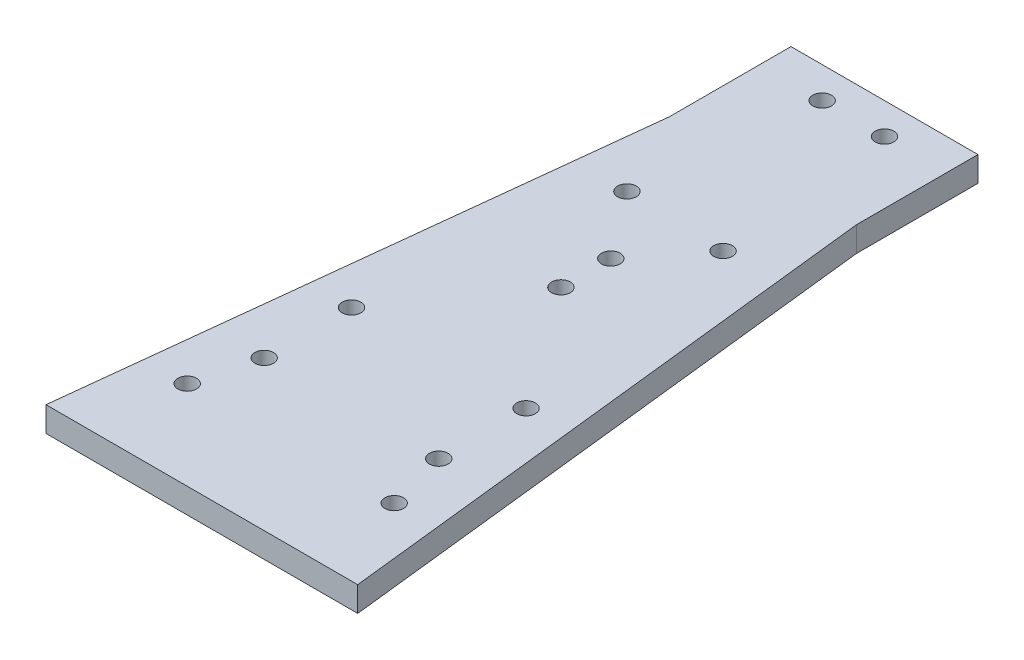
ISO-10303-21;
HEADER;
FILE_DESCRIPTION(('STEP AP214'),'2;1');
FILE_NAME('part.step','',(''),(''),'','','');
FILE_SCHEMA(('AUTOMOTIVE_DESIGN { 1 0 10303 214 1 1 1 1 }'));
ENDSEC;
DATA;
#1=APPLICATION_CONTEXT('core data for automotive mechanical design processes');
#2=APPLICATION_PROTOCOL_DEFINITION('international standard','automotive_design',2000,#1);
#3=PRODUCT_CONTEXT('',#1,'mechanical');
#4=PRODUCT('Part','Part','',(#3));
#5=PRODUCT_RELATED_PRODUCT_CATEGORY('part','',(#4));
#6=PRODUCT_DEFINITION_FORMATION('','',#4);
#7=PRODUCT_DEFINITION_CONTEXT('part definition',#1,'design');
#8=PRODUCT_DEFINITION('design','',#6,#7);
#9=PRODUCT_DEFINITION_SHAPE('','',#8);
#10=(LENGTH_UNIT() NAMED_UNIT(*) SI_UNIT(.MILLI.,.METRE.));
#11=(NAMED_UNIT(*) PLANE_ANGLE_UNIT() SI_UNIT($,.RADIAN.));
#12=(NAMED_UNIT(*) SI_UNIT($,.STERADIAN.) SOLID_ANGLE_UNIT());
#13=UNCERTAINTY_MEASURE_WITH_UNIT(LENGTH_MEASURE(1.E-05),#10,'distance_accuracy_value','');
#14=(GEOMETRIC_REPRESENTATION_CONTEXT(3) GLOBAL_UNCERTAINTY_ASSIGNED_CONTEXT((#13)) GLOBAL_UNIT_ASSIGNED_CONTEXT((#10,
#11,#12)) REPRESENTATION_CONTEXT('',''));
#15=CARTESIAN_POINT('',(0.,0.,0.));
#16=DIRECTION('',(0.,0.,1.));
#17=DIRECTION('',(1.,0.,0.));
#18=AXIS2_PLACEMENT_3D('',#15,#16,#17);
#19=CARTESIAN_POINT('',(-9.99999999999999,4.,90.));
#20=DIRECTION('',(0.993883734673619,0.,0.110431526074846));
#21=DIRECTION('',(0.110431526074846,0.,-0.993883734673619));
#22=AXIS2_PLACEMENT_3D('',#19,#20,#21);
#23=PLANE('',#22);
#24=DIRECTION('',(-0.110431526074847,0.,0.993883734673619));
#25=VECTOR('',#24,1.);
#26=CARTESIAN_POINT('',(-9.99999999999999,0.,90.));
#27=LINE('',#26,#25);
#28=CARTESIAN_POINT('',(0.,0.,0.));
#29=VERTEX_POINT('',#28);
#30=CARTESIAN_POINT('',(-9.99999999999999,0.,90.));
#31=VERTEX_POINT('',#30);
#32=EDGE_CURVE('E167',#29,#31,#27,.T.);
#33=ORIENTED_EDGE('',*,*,#32,.T.);
#34=DIRECTION('',(0.,-1.,0.));
#35=VECTOR('',#34,1.);
#36=CARTESIAN_POINT('',(-9.99999999999999,4.,90.));
#37=LINE('',#36,#35);
#38=CARTESIAN_POINT('',(-9.99999999999999,4.,90.));
#39=VERTEX_POINT('',#38);
#40=EDGE_CURVE('E11',#39,#31,#37,.T.);
#41=ORIENTED_EDGE('',*,*,#40,.F.);
#42=DIRECTION('',(-0.110431526074847,0.,0.993883734673619));
#43=VECTOR('',#42,1.);
#44=CARTESIAN_POINT('',(-9.99999999999999,4.,90.));
#45=LINE('',#44,#43);
#46=CARTESIAN_POINT('',(0.,4.,0.));
#47=VERTEX_POINT('',#46);
#48=EDGE_CURVE('E52',#47,#39,#45,.T.);
#49=ORIENTED_EDGE('',*,*,#48,.F.);
#50=DIRECTION('',(0.,-1.,0.));
#51=VECTOR('',#50,1.);
#52=CARTESIAN_POINT('',(0.,4.,0.));
#53=LINE('',#52,#51);
#54=EDGE_CURVE('E71',#47,#29,#53,.T.);
#55=ORIENTED_EDGE('',*,*,#54,.T.);
#56=EDGE_LOOP('',(#33,#41,#49,#55));
#57=FACE_BOUND('',#56,.T.);
#58=ADVANCED_FACE('F34',(#57),#23,.F.);
#59=CARTESIAN_POINT('',(40.,4.,90.));
#60=DIRECTION('',(0.,0.,-1.));
#61=DIRECTION('',(-1.,0.,0.));
#62=AXIS2_PLACEMENT_3D('',#59,#60,#61);
#63=PLANE('',#62);
#64=DIRECTION('',(1.,0.,0.));
#65=VECTOR('',#64,1.);
#66=CARTESIAN_POINT('',(40.,0.,90.));
#67=LINE('',#66,#65);
#68=CARTESIAN_POINT('',(40.,0.,90.));
#69=VERTEX_POINT('',#68);
#70=EDGE_CURVE('E66',#31,#69,#67,.T.);
#71=ORIENTED_EDGE('',*,*,#70,.T.);
#72=DIRECTION('',(0.,-1.,0.));
#73=VECTOR('',#72,1.);
#74=CARTESIAN_POINT('',(40.,4.,90.));
#75=LINE('',#74,#73);
#76=CARTESIAN_POINT('',(40.,4.,90.));
#77=VERTEX_POINT('',#76);
#78=EDGE_CURVE('E43',#77,#69,#75,.T.);
#79=ORIENTED_EDGE('',*,*,#78,.F.);
#80=DIRECTION('',(1.,0.,0.));
#81=VECTOR('',#80,1.);
#82=CARTESIAN_POINT('',(40.,4.,90.));
#83=LINE('',#82,#81);
#84=EDGE_CURVE('E76',#39,#77,#83,.T.);
#85=ORIENTED_EDGE('',*,*,#84,.F.);
#86=ORIENTED_EDGE('',*,*,#40,.T.);
#87=EDGE_LOOP('',(#71,#79,#85,#86));
#88=FACE_BOUND('',#87,.T.);
#89=ADVANCED_FACE('F260',(#88),#63,.F.);
#90=CARTESIAN_POINT('',(40.,4.,90.));
#91=DIRECTION('',(-0.993883734673619,0.,0.110431526074847));
#92=DIRECTION('',(0.110431526074847,0.,0.993883734673619));
#93=AXIS2_PLACEMENT_3D('',#90,#91,#92);
#94=PLANE('',#93);
#95=DIRECTION('',(-0.110431526074847,0.,-0.993883734673619));
#96=VECTOR('',#95,1.);
#97=CARTESIAN_POINT('',(40.,0.,90.));
#98=LINE('',#97,#96);
#99=CARTESIAN_POINT('',(30.,0.,0.));
#100=VERTEX_POINT('',#99);
#101=EDGE_CURVE('E171',#69,#100,#98,.T.);
#102=ORIENTED_EDGE('',*,*,#101,.T.);
#103=DIRECTION('',(0.,-1.,0.));
#104=VECTOR('',#103,1.);
#105=CARTESIAN_POINT('',(30.,4.,0.));
#106=LINE('',#105,#104);
#107=CARTESIAN_POINT('',(30.,4.,0.));
#108=VERTEX_POINT('',#107);
#109=EDGE_CURVE('E179',#108,#100,#106,.T.);
#110=ORIENTED_EDGE('',*,*,#109,.F.);
#111=DIRECTION('',(-0.110431526074847,0.,-0.993883734673619));
#112=VECTOR('',#111,1.);
#113=CARTESIAN_POINT('',(40.,4.,90.));
#114=LINE('',#113,#112);
#115=EDGE_CURVE('E173',#77,#108,#114,.T.);
#116=ORIENTED_EDGE('',*,*,#115,.F.);
#117=ORIENTED_EDGE('',*,*,#78,.T.);
#118=EDGE_LOOP('',(#102,#110,#116,#117));
#119=FACE_BOUND('',#118,.T.);
#120=ADVANCED_FACE('F264',(#119),#94,.F.);
#121=CARTESIAN_POINT('',(0.,4.,0.));
#122=DIRECTION('',(0.,-1.,0.));
#123=DIRECTION('',(0.,0.,-1.));
#124=AXIS2_PLACEMENT_3D('',#121,#122,#123);
#125=PLANE('',#124);
#126=CARTESIAN_POINT('',(10.,4.,-14.5));
#127=DIRECTION('',(0.,-1.,0.));
#128=DIRECTION('',(0.,0.,-1.));
#129=AXIS2_PLACEMENT_3D('',#126,#127,#128);
#130=CIRCLE('',#129,1.5);
#131=CARTESIAN_POINT('',(10.,4.,-16.));
#132=VERTEX_POINT('',#131);
#133=EDGE_CURVE('E112',#132,#132,#130,.T.);
#134=ORIENTED_EDGE('',*,*,#133,.T.);
#135=EDGE_LOOP('',(#134));
#136=FACE_BOUND('',#135,.T.);
#137=CARTESIAN_POINT('',(20.,4.,-14.5));
#138=DIRECTION('',(0.,-1.,0.));
#139=DIRECTION('',(0.,0.,-1.));
#140=AXIS2_PLACEMENT_3D('',#137,#138,#139);
#141=CIRCLE('',#140,1.5);
#142=CARTESIAN_POINT('',(20.,4.,-16.));
#143=VERTEX_POINT('',#142);
#144=EDGE_CURVE('E230',#143,#143,#141,.T.);
#145=ORIENTED_EDGE('',*,*,#144,.T.);
#146=EDGE_LOOP('',(#145));
#147=FACE_BOUND('',#146,.T.);
#148=CARTESIAN_POINT('',(31.5999999999999,4.,75.7500000000001));
#149=DIRECTION('',(0.,1.,0.));
#150=DIRECTION('',(0.,0.,1.));
#151=AXIS2_PLACEMENT_3D('',#148,#149,#150);
#152=CIRCLE('',#151,1.5);
#153=CARTESIAN_POINT('',(31.5999999999999,4.,77.2500000000001));
#154=VERTEX_POINT('',#153);
#155=EDGE_CURVE('E115',#154,#154,#152,.T.);
#156=ORIENTED_EDGE('',*,*,#155,.F.);
#157=EDGE_LOOP('',(#156));
#158=FACE_BOUND('',#157,.T.);
#159=CARTESIAN_POINT('',(-1.60000000000006,4.,75.7499999999999));
#160=DIRECTION('',(0.,1.,0.));
#161=DIRECTION('',(0.,0.,1.));
#162=AXIS2_PLACEMENT_3D('',#159,#160,#161);
#163=CIRCLE('',#162,1.49999999999994);
#164=CARTESIAN_POINT('',(-1.60000000000006,4.,77.2499999999999));
#165=VERTEX_POINT('',#164);
#166=EDGE_CURVE('E118',#165,#165,#163,.T.);
#167=ORIENTED_EDGE('',*,*,#166,.F.);
#168=EDGE_LOOP('',(#167));
#169=FACE_BOUND('',#168,.T.);
#170=CARTESIAN_POINT('',(22.9530548812237,4.,14.3472000298422));
#171=DIRECTION('',(0.,1.,0.));
#172=DIRECTION('',(0.,0.,1.));
#173=AXIS2_PLACEMENT_3D('',#170,#171,#172);
#174=CIRCLE('',#173,1.5);
#175=CARTESIAN_POINT('',(22.9530548812237,4.,15.8472000298422));
#176=VERTEX_POINT('',#175);
#177=EDGE_CURVE('E124',#176,#176,#174,.T.);
#178=ORIENTED_EDGE('',*,*,#177,.F.);
#179=EDGE_LOOP('',(#178));
#180=FACE_BOUND('',#179,.T.);
#181=CARTESIAN_POINT('',(6.96315472119461,4.,13.7787874399901));
#182=DIRECTION('',(0.,1.,0.));
#183=DIRECTION('',(0.,0.,1.));
#184=AXIS2_PLACEMENT_3D('',#181,#182,#183);
#185=CIRCLE('',#184,1.5);
#186=CARTESIAN_POINT('',(6.96315472119461,4.,15.2787874399902));
#187=VERTEX_POINT('',#186);
#188=EDGE_CURVE('E127',#187,#187,#185,.T.);
#189=ORIENTED_EDGE('',*,*,#188,.F.);
#190=EDGE_LOOP('',(#189));
#191=FACE_BOUND('',#190,.T.);
#192=CARTESIAN_POINT('',(15.,4.,32.4));
#193=DIRECTION('',(0.,1.,0.));
#194=DIRECTION('',(0.,0.,1.));
#195=AXIS2_PLACEMENT_3D('',#192,#193,#194);
#196=CIRCLE('',#195,1.5);
#197=CARTESIAN_POINT('',(15.,4.,33.9));
#198=VERTEX_POINT('',#197);
#199=EDGE_CURVE('E137',#198,#198,#196,.T.);
#200=ORIENTED_EDGE('',*,*,#199,.F.);
#201=EDGE_LOOP('',(#200));
#202=FACE_BOUND('',#201,.T.);
#203=CARTESIAN_POINT('',(15.,4.,24.4));
#204=DIRECTION('',(0.,1.,0.));
#205=DIRECTION('',(0.,0.,1.));
#206=AXIS2_PLACEMENT_3D('',#203,#204,#205);
#207=CIRCLE('',#206,1.5);
#208=CARTESIAN_POINT('',(15.,4.,25.9));
#209=VERTEX_POINT('',#208);
#210=EDGE_CURVE('E143',#209,#209,#207,.T.);
#211=ORIENTED_EDGE('',*,*,#210,.F.);
#212=EDGE_LOOP('',(#211));
#213=FACE_BOUND('',#212,.T.);
#214=CARTESIAN_POINT('',(1.00000000000001,4.,52.));
#215=DIRECTION('',(0.,1.,0.));
#216=DIRECTION('',(0.,0.,1.));
#217=AXIS2_PLACEMENT_3D('',#214,#215,#216);
#218=CIRCLE('',#217,1.5);
#219=CARTESIAN_POINT('',(1.00000000000001,4.,53.5));
#220=VERTEX_POINT('',#219);
#221=EDGE_CURVE('E156',#220,#220,#218,.T.);
#222=ORIENTED_EDGE('',*,*,#221,.F.);
#223=EDGE_LOOP('',(#222));
#224=FACE_BOUND('',#223,.T.);
#225=CARTESIAN_POINT('',(29.,4.,66.));
#226=DIRECTION('',(0.,1.,0.));
#227=DIRECTION('',(0.,0.,1.));
#228=AXIS2_PLACEMENT_3D('',#225,#226,#227);
#229=CIRCLE('',#228,1.5);
#230=CARTESIAN_POINT('',(29.,4.,67.5));
#231=VERTEX_POINT('',#230);
#232=EDGE_CURVE('E149',#231,#231,#229,.T.);
#233=ORIENTED_EDGE('',*,*,#232,.F.);
#234=EDGE_LOOP('',(#233));
#235=FACE_BOUND('',#234,.T.);
#236=CARTESIAN_POINT('',(29.,4.,52.));
#237=DIRECTION('',(0.,1.,0.));
#238=DIRECTION('',(0.,0.,1.));
#239=AXIS2_PLACEMENT_3D('',#236,#237,#238);
#240=CIRCLE('',#239,1.5);
#241=CARTESIAN_POINT('',(29.,4.,53.5));
#242=VERTEX_POINT('',#241);
#243=EDGE_CURVE('E136',#242,#242,#240,.T.);
#244=ORIENTED_EDGE('',*,*,#243,.F.);
#245=EDGE_LOOP('',(#244));
#246=FACE_BOUND('',#245,.T.);
#247=CARTESIAN_POINT('',(1.00000000000001,4.,66.));
#248=DIRECTION('',(0.,1.,0.));
#249=DIRECTION('',(0.,0.,1.));
#250=AXIS2_PLACEMENT_3D('',#247,#248,#249);
#251=CIRCLE('',#250,1.5);
#252=CARTESIAN_POINT('',(1.00000000000001,4.,67.5));
#253=VERTEX_POINT('',#252);
#254=EDGE_CURVE('E155',#253,#253,#251,.T.);
#255=ORIENTED_EDGE('',*,*,#254,.F.);
#256=EDGE_LOOP('',(#255));
#257=FACE_BOUND('',#256,.T.);
#258=ORIENTED_EDGE('',*,*,#48,.T.);
#259=ORIENTED_EDGE('',*,*,#84,.T.);
#260=ORIENTED_EDGE('',*,*,#115,.T.);
#261=DIRECTION('',(0.,0.,1.));
#262=VECTOR('',#261,1.);
#263=CARTESIAN_POINT('',(30.,4.,-19.5));
#264=LINE('',#263,#262);
#265=CARTESIAN_POINT('',(30.,4.,-19.5));
#266=VERTEX_POINT('',#265);
#267=EDGE_CURVE('E99',#266,#108,#264,.T.);
#268=ORIENTED_EDGE('',*,*,#267,.F.);
#269=DIRECTION('',(1.,0.,0.));
#270=VECTOR('',#269,1.);
#271=CARTESIAN_POINT('',(0.,4.,-19.5));
#272=LINE('',#271,#270);
#273=CARTESIAN_POINT('',(0.,4.,-19.5));
#274=VERTEX_POINT('',#273);
#275=EDGE_CURVE('E93',#274,#266,#272,.T.);
#276=ORIENTED_EDGE('',*,*,#275,.F.);
#277=DIRECTION('',(0.,0.,1.));
#278=VECTOR('',#277,1.);
#279=CARTESIAN_POINT('',(0.,4.,-19.5));
#280=LINE('',#279,#278);
#281=EDGE_CURVE('E97',#274,#47,#280,.T.);
#282=ORIENTED_EDGE('',*,*,#281,.T.);
#283=EDGE_LOOP('',(#258,#259,#260,#268,#276,#282));
#284=FACE_BOUND('',#283,.T.);
#285=ADVANCED_FACE('F95',(#136,#147,#158,#169,#180,#191,#202,#213,#224,#235,#246,#257,#284),
#125,.F.);
#286=CARTESIAN_POINT('',(0.,0.,0.));
#287=DIRECTION('',(0.,-1.,0.));
#288=DIRECTION('',(0.,0.,-1.));
#289=AXIS2_PLACEMENT_3D('',#286,#287,#288);
#290=PLANE('',#289);
#291=CARTESIAN_POINT('',(10.,0.,-14.5));
#292=DIRECTION('',(0.,-1.,0.));
#293=DIRECTION('',(0.,0.,-1.));
#294=AXIS2_PLACEMENT_3D('',#291,#292,#293);
#295=CIRCLE('',#294,1.5);
#296=CARTESIAN_POINT('',(10.,0.,-16.));
#297=VERTEX_POINT('',#296);
#298=EDGE_CURVE('E233',#297,#297,#295,.T.);
#299=ORIENTED_EDGE('',*,*,#298,.F.);
#300=EDGE_LOOP('',(#299));
#301=FACE_BOUND('',#300,.T.);
#302=CARTESIAN_POINT('',(20.,0.,-14.5));
#303=DIRECTION('',(0.,-1.,0.));
#304=DIRECTION('',(0.,0.,-1.));
#305=AXIS2_PLACEMENT_3D('',#302,#303,#304);
#306=CIRCLE('',#305,1.5);
#307=CARTESIAN_POINT('',(20.,0.,-16.));
#308=VERTEX_POINT('',#307);
#309=EDGE_CURVE('E227',#308,#308,#306,.T.);
#310=ORIENTED_EDGE('',*,*,#309,.F.);
#311=EDGE_LOOP('',(#310));
#312=FACE_BOUND('',#311,.T.);
#313=CARTESIAN_POINT('',(31.5999999999999,0.,75.7500000000001));
#314=DIRECTION('',(0.,-1.,0.));
#315=DIRECTION('',(0.,0.,-1.));
#316=AXIS2_PLACEMENT_3D('',#313,#314,#315);
#317=CIRCLE('',#316,1.5);
#318=CARTESIAN_POINT('',(31.5999999999999,0.,74.2500000000001));
#319=VERTEX_POINT('',#318);
#320=EDGE_CURVE('E37',#319,#319,#317,.T.);
#321=ORIENTED_EDGE('',*,*,#320,.F.);
#322=EDGE_LOOP('',(#321));
#323=FACE_BOUND('',#322,.T.);
#324=CARTESIAN_POINT('',(-1.60000000000006,0.,75.7499999999999));
#325=DIRECTION('',(0.,-1.,0.));
#326=DIRECTION('',(0.,0.,-1.));
#327=AXIS2_PLACEMENT_3D('',#324,#325,#326);
#328=CIRCLE('',#327,1.49999999999994);
#329=CARTESIAN_POINT('',(-1.60000000000006,0.,74.25));
#330=VERTEX_POINT('',#329);
#331=EDGE_CURVE('E187',#330,#330,#328,.T.);
#332=ORIENTED_EDGE('',*,*,#331,.F.);
#333=EDGE_LOOP('',(#332));
#334=FACE_BOUND('',#333,.T.);
#335=CARTESIAN_POINT('',(22.9530548812237,0.,14.3472000298422));
#336=DIRECTION('',(0.,-1.,0.));
#337=DIRECTION('',(0.,0.,-1.));
#338=AXIS2_PLACEMENT_3D('',#335,#336,#337);
#339=CIRCLE('',#338,1.5);
#340=CARTESIAN_POINT('',(22.9530548812237,0.,12.8472000298422));
#341=VERTEX_POINT('',#340);
#342=EDGE_CURVE('E185',#341,#341,#339,.T.);
#343=ORIENTED_EDGE('',*,*,#342,.F.);
#344=EDGE_LOOP('',(#343));
#345=FACE_BOUND('',#344,.T.);
#346=CARTESIAN_POINT('',(6.96315472119461,0.,13.7787874399901));
#347=DIRECTION('',(0.,-1.,0.));
#348=DIRECTION('',(0.,0.,-1.));
#349=AXIS2_PLACEMENT_3D('',#346,#347,#348);
#350=CIRCLE('',#349,1.5);
#351=CARTESIAN_POINT('',(6.96315472119461,0.,12.2787874399901));
#352=VERTEX_POINT('',#351);
#353=EDGE_CURVE('E132',#352,#352,#350,.T.);
#354=ORIENTED_EDGE('',*,*,#353,.F.);
#355=EDGE_LOOP('',(#354));
#356=FACE_BOUND('',#355,.T.);
#357=CARTESIAN_POINT('',(15.,0.,32.4));
#358=DIRECTION('',(0.,1.,0.));
#359=DIRECTION('',(0.,0.,1.));
#360=AXIS2_PLACEMENT_3D('',#357,#358,#359);
#361=CIRCLE('',#360,1.5);
#362=CARTESIAN_POINT('',(15.,0.,33.9));
#363=VERTEX_POINT('',#362);
#364=EDGE_CURVE('E133',#363,#363,#361,.T.);
#365=ORIENTED_EDGE('',*,*,#364,.T.);
#366=EDGE_LOOP('',(#365));
#367=FACE_BOUND('',#366,.T.);
#368=CARTESIAN_POINT('',(15.,0.,24.4));
#369=DIRECTION('',(0.,1.,0.));
#370=DIRECTION('',(0.,0.,1.));
#371=AXIS2_PLACEMENT_3D('',#368,#369,#370);
#372=CIRCLE('',#371,1.5);
#373=CARTESIAN_POINT('',(15.,0.,25.9));
#374=VERTEX_POINT('',#373);
#375=EDGE_CURVE('E140',#374,#374,#372,.T.);
#376=ORIENTED_EDGE('',*,*,#375,.T.);
#377=EDGE_LOOP('',(#376));
#378=FACE_BOUND('',#377,.T.);
#379=CARTESIAN_POINT('',(1.00000000000001,0.,52.));
#380=DIRECTION('',(0.,1.,0.));
#381=DIRECTION('',(0.,0.,1.));
#382=AXIS2_PLACEMENT_3D('',#379,#380,#381);
#383=CIRCLE('',#382,1.5);
#384=CARTESIAN_POINT('',(1.00000000000001,0.,53.5));
#385=VERTEX_POINT('',#384);
#386=EDGE_CURVE('E152',#385,#385,#383,.T.);
#387=ORIENTED_EDGE('',*,*,#386,.T.);
#388=EDGE_LOOP('',(#387));
#389=FACE_BOUND('',#388,.T.);
#390=CARTESIAN_POINT('',(29.,0.,66.));
#391=DIRECTION('',(0.,1.,0.));
#392=DIRECTION('',(0.,0.,1.));
#393=AXIS2_PLACEMENT_3D('',#390,#391,#392);
#394=CIRCLE('',#393,1.5);
#395=CARTESIAN_POINT('',(29.,0.,67.5));
#396=VERTEX_POINT('',#395);
#397=EDGE_CURVE('E159',#396,#396,#394,.T.);
#398=ORIENTED_EDGE('',*,*,#397,.T.);
#399=EDGE_LOOP('',(#398));
#400=FACE_BOUND('',#399,.T.);
#401=CARTESIAN_POINT('',(29.,0.,52.));
#402=DIRECTION('',(0.,1.,0.));
#403=DIRECTION('',(0.,0.,1.));
#404=AXIS2_PLACEMENT_3D('',#401,#402,#403);
#405=CIRCLE('',#404,1.5);
#406=CARTESIAN_POINT('',(29.,0.,53.5));
#407=VERTEX_POINT('',#406);
#408=EDGE_CURVE('E146',#407,#407,#405,.T.);
#409=ORIENTED_EDGE('',*,*,#408,.T.);
#410=EDGE_LOOP('',(#409));
#411=FACE_BOUND('',#410,.T.);
#412=CARTESIAN_POINT('',(1.00000000000001,0.,66.));
#413=DIRECTION('',(0.,1.,0.));
#414=DIRECTION('',(0.,0.,1.));
#415=AXIS2_PLACEMENT_3D('',#412,#413,#414);
#416=CIRCLE('',#415,1.5);
#417=CARTESIAN_POINT('',(1.00000000000001,0.,67.5));
#418=VERTEX_POINT('',#417);
#419=EDGE_CURVE('E164',#418,#418,#416,.T.);
#420=ORIENTED_EDGE('',*,*,#419,.T.);
#421=EDGE_LOOP('',(#420));
#422=FACE_BOUND('',#421,.T.);
#423=ORIENTED_EDGE('',*,*,#32,.F.);
#424=DIRECTION('',(0.,0.,1.));
#425=VECTOR('',#424,1.);
#426=CARTESIAN_POINT('',(0.,0.,-19.5));
#427=LINE('',#426,#425);
#428=CARTESIAN_POINT('',(0.,0.,-19.5));
#429=VERTEX_POINT('',#428);
#430=EDGE_CURVE('E220',#429,#29,#427,.T.);
#431=ORIENTED_EDGE('',*,*,#430,.F.);
#432=DIRECTION('',(-1.,0.,0.));
#433=VECTOR('',#432,1.);
#434=CARTESIAN_POINT('',(0.,0.,-19.5));
#435=LINE('',#434,#433);
#436=CARTESIAN_POINT('',(30.,0.,-19.5));
#437=VERTEX_POINT('',#436);
#438=EDGE_CURVE('E108',#437,#429,#435,.T.);
#439=ORIENTED_EDGE('',*,*,#438,.F.);
#440=DIRECTION('',(0.,0.,1.));
#441=VECTOR('',#440,1.);
#442=CARTESIAN_POINT('',(30.,0.,-19.5));
#443=LINE('',#442,#441);
#444=EDGE_CURVE('E120',#437,#100,#443,.T.);
#445=ORIENTED_EDGE('',*,*,#444,.T.);
#446=ORIENTED_EDGE('',*,*,#101,.F.);
#447=ORIENTED_EDGE('',*,*,#70,.F.);
#448=EDGE_LOOP('',(#423,#431,#439,#445,#446,#447));
#449=FACE_BOUND('',#448,.T.);
#450=ADVANCED_FACE('F197',(#301,#312,#323,#334,#345,#356,#367,#378,#389,#400,#411,#422,#449),
#290,.T.);
#451=CARTESIAN_POINT('',(1.00000000000001,0.,66.));
#452=DIRECTION('',(0.,1.,0.));
#453=DIRECTION('',(0.,0.,1.));
#454=AXIS2_PLACEMENT_3D('',#451,#452,#453);
#455=CYLINDRICAL_SURFACE('',#454,1.5);
#456=ORIENTED_EDGE('',*,*,#419,.F.);
#457=EDGE_LOOP('',(#456));
#458=FACE_BOUND('',#457,.T.);
#459=ORIENTED_EDGE('',*,*,#254,.T.);
#460=EDGE_LOOP('',(#459));
#461=FACE_BOUND('',#460,.T.);
#462=ADVANCED_FACE('F200',(#458,#461),#455,.F.);
#463=CARTESIAN_POINT('',(29.,0.,52.));
#464=DIRECTION('',(0.,1.,0.));
#465=DIRECTION('',(0.,0.,1.));
#466=AXIS2_PLACEMENT_3D('',#463,#464,#465);
#467=CYLINDRICAL_SURFACE('',#466,1.5);
#468=ORIENTED_EDGE('',*,*,#408,.F.);
#469=EDGE_LOOP('',(#468));
#470=FACE_BOUND('',#469,.T.);
#471=ORIENTED_EDGE('',*,*,#243,.T.);
#472=EDGE_LOOP('',(#471));
#473=FACE_BOUND('',#472,.T.);
#474=ADVANCED_FACE('F275',(#470,#473),#467,.F.);
#475=CARTESIAN_POINT('',(29.,0.,66.));
#476=DIRECTION('',(0.,1.,0.));
#477=DIRECTION('',(0.,0.,1.));
#478=AXIS2_PLACEMENT_3D('',#475,#476,#477);
#479=CYLINDRICAL_SURFACE('',#478,1.5);
#480=ORIENTED_EDGE('',*,*,#397,.F.);
#481=EDGE_LOOP('',(#480));
#482=FACE_BOUND('',#481,.T.);
#483=ORIENTED_EDGE('',*,*,#232,.T.);
#484=EDGE_LOOP('',(#483));
#485=FACE_BOUND('',#484,.T.);
#486=ADVANCED_FACE('F277',(#482,#485),#479,.F.);
#487=CARTESIAN_POINT('',(1.00000000000001,0.,52.));
#488=DIRECTION('',(0.,1.,0.));
#489=DIRECTION('',(0.,0.,1.));
#490=AXIS2_PLACEMENT_3D('',#487,#488,#489);
#491=CYLINDRICAL_SURFACE('',#490,1.5);
#492=ORIENTED_EDGE('',*,*,#386,.F.);
#493=EDGE_LOOP('',(#492));
#494=FACE_BOUND('',#493,.T.);
#495=ORIENTED_EDGE('',*,*,#221,.T.);
#496=EDGE_LOOP('',(#495));
#497=FACE_BOUND('',#496,.T.);
#498=ADVANCED_FACE('F280',(#494,#497),#491,.F.);
#499=CARTESIAN_POINT('',(15.,0.,24.4));
#500=DIRECTION('',(0.,1.,0.));
#501=DIRECTION('',(0.,0.,1.));
#502=AXIS2_PLACEMENT_3D('',#499,#500,#501);
#503=CYLINDRICAL_SURFACE('',#502,1.5);
#504=ORIENTED_EDGE('',*,*,#375,.F.);
#505=EDGE_LOOP('',(#504));
#506=FACE_BOUND('',#505,.T.);
#507=ORIENTED_EDGE('',*,*,#210,.T.);
#508=EDGE_LOOP('',(#507));
#509=FACE_BOUND('',#508,.T.);
#510=ADVANCED_FACE('F284',(#506,#509),#503,.F.);
#511=CARTESIAN_POINT('',(15.,0.,32.4));
#512=DIRECTION('',(0.,1.,0.));
#513=DIRECTION('',(0.,0.,1.));
#514=AXIS2_PLACEMENT_3D('',#511,#512,#513);
#515=CYLINDRICAL_SURFACE('',#514,1.5);
#516=ORIENTED_EDGE('',*,*,#364,.F.);
#517=EDGE_LOOP('',(#516));
#518=FACE_BOUND('',#517,.T.);
#519=ORIENTED_EDGE('',*,*,#199,.T.);
#520=EDGE_LOOP('',(#519));
#521=FACE_BOUND('',#520,.T.);
#522=ADVANCED_FACE('F291',(#518,#521),#515,.F.);
#523=CARTESIAN_POINT('',(6.96315472119461,-6.,13.7787874399901));
#524=DIRECTION('',(0.,1.,0.));
#525=DIRECTION('',(0.,0.,1.));
#526=AXIS2_PLACEMENT_3D('',#523,#524,#525);
#527=CYLINDRICAL_SURFACE('',#526,1.5);
#528=ORIENTED_EDGE('',*,*,#353,.T.);
#529=EDGE_LOOP('',(#528));
#530=FACE_BOUND('',#529,.T.);
#531=ORIENTED_EDGE('',*,*,#188,.T.);
#532=EDGE_LOOP('',(#531));
#533=FACE_BOUND('',#532,.T.);
#534=ADVANCED_FACE('F295',(#530,#533),#527,.F.);
#535=CARTESIAN_POINT('',(22.9530548812237,-6.,14.3472000298422));
#536=DIRECTION('',(0.,1.,0.));
#537=DIRECTION('',(0.,0.,1.));
#538=AXIS2_PLACEMENT_3D('',#535,#536,#537);
#539=CYLINDRICAL_SURFACE('',#538,1.5);
#540=ORIENTED_EDGE('',*,*,#342,.T.);
#541=EDGE_LOOP('',(#540));
#542=FACE_BOUND('',#541,.T.);
#543=ORIENTED_EDGE('',*,*,#177,.T.);
#544=EDGE_LOOP('',(#543));
#545=FACE_BOUND('',#544,.T.);
#546=ADVANCED_FACE('F299',(#542,#545),#539,.F.);
#547=CARTESIAN_POINT('',(-1.60000000000006,-6.,75.7499999999999));
#548=DIRECTION('',(0.,1.,0.));
#549=DIRECTION('',(0.,0.,1.));
#550=AXIS2_PLACEMENT_3D('',#547,#548,#549);
#551=CYLINDRICAL_SURFACE('',#550,1.49999999999994);
#552=ORIENTED_EDGE('',*,*,#331,.T.);
#553=EDGE_LOOP('',(#552));
#554=FACE_BOUND('',#553,.T.);
#555=ORIENTED_EDGE('',*,*,#166,.T.);
#556=EDGE_LOOP('',(#555));
#557=FACE_BOUND('',#556,.T.);
#558=ADVANCED_FACE('F303',(#554,#557),#551,.F.);
#559=CARTESIAN_POINT('',(31.5999999999999,-6.,75.7500000000001));
#560=DIRECTION('',(0.,1.,0.));
#561=DIRECTION('',(0.,0.,1.));
#562=AXIS2_PLACEMENT_3D('',#559,#560,#561);
#563=CYLINDRICAL_SURFACE('',#562,1.5);
#564=ORIENTED_EDGE('',*,*,#320,.T.);
#565=EDGE_LOOP('',(#564));
#566=FACE_BOUND('',#565,.T.);
#567=ORIENTED_EDGE('',*,*,#155,.T.);
#568=EDGE_LOOP('',(#567));
#569=FACE_BOUND('',#568,.T.);
#570=ADVANCED_FACE('F194',(#566,#569),#563,.F.);
#571=CARTESIAN_POINT('',(0.,0.,-19.5));
#572=DIRECTION('',(1.,0.,0.));
#573=DIRECTION('',(0.,0.,-1.));
#574=AXIS2_PLACEMENT_3D('',#571,#572,#573);
#575=PLANE('',#574);
#576=ORIENTED_EDGE('',*,*,#54,.F.);
#577=ORIENTED_EDGE('',*,*,#281,.F.);
#578=DIRECTION('',(0.,1.,0.));
#579=VECTOR('',#578,1.);
#580=CARTESIAN_POINT('',(0.,0.,-19.5));
#581=LINE('',#580,#579);
#582=EDGE_CURVE('E103',#429,#274,#581,.T.);
#583=ORIENTED_EDGE('',*,*,#582,.F.);
#584=ORIENTED_EDGE('',*,*,#430,.T.);
#585=EDGE_LOOP('',(#576,#577,#583,#584));
#586=FACE_BOUND('',#585,.T.);
#587=ADVANCED_FACE('F114',(#586),#575,.F.);
#588=CARTESIAN_POINT('',(30.,0.,-19.5));
#589=DIRECTION('',(-1.,0.,0.));
#590=DIRECTION('',(0.,0.,1.));
#591=AXIS2_PLACEMENT_3D('',#588,#589,#590);
#592=PLANE('',#591);
#593=ORIENTED_EDGE('',*,*,#109,.T.);
#594=ORIENTED_EDGE('',*,*,#444,.F.);
#595=DIRECTION('',(0.,-1.,0.));
#596=VECTOR('',#595,1.);
#597=CARTESIAN_POINT('',(30.,0.,-19.5));
#598=LINE('',#597,#596);
#599=EDGE_CURVE('E102',#266,#437,#598,.T.);
#600=ORIENTED_EDGE('',*,*,#599,.F.);
#601=ORIENTED_EDGE('',*,*,#267,.T.);
#602=EDGE_LOOP('',(#593,#594,#600,#601));
#603=FACE_BOUND('',#602,.T.);
#604=ADVANCED_FACE('F256',(#603),#592,.F.);
#605=CARTESIAN_POINT('',(0.,0.,-19.5));
#606=DIRECTION('',(0.,0.,-1.));
#607=DIRECTION('',(-1.,0.,0.));
#608=AXIS2_PLACEMENT_3D('',#605,#606,#607);
#609=PLANE('',#608);
#610=ORIENTED_EDGE('',*,*,#582,.T.);
#611=ORIENTED_EDGE('',*,*,#275,.T.);
#612=ORIENTED_EDGE('',*,*,#599,.T.);
#613=ORIENTED_EDGE('',*,*,#438,.T.);
#614=EDGE_LOOP('',(#610,#611,#612,#613));
#615=FACE_BOUND('',#614,.T.);
#616=ADVANCED_FACE('F106',(#615),#609,.T.);
#617=CARTESIAN_POINT('',(20.,4.,-14.5));
#618=DIRECTION('',(0.,-1.,0.));
#619=DIRECTION('',(0.,0.,-1.));
#620=AXIS2_PLACEMENT_3D('',#617,#618,#619);
#621=CYLINDRICAL_SURFACE('',#620,1.5);
#622=ORIENTED_EDGE('',*,*,#144,.F.);
#623=EDGE_LOOP('',(#622));
#624=FACE_BOUND('',#623,.T.);
#625=ORIENTED_EDGE('',*,*,#309,.T.);
#626=EDGE_LOOP('',(#625));
#627=FACE_BOUND('',#626,.T.);
#628=ADVANCED_FACE('F244',(#624,#627),#621,.F.);
#629=CARTESIAN_POINT('',(10.,4.,-14.5));
#630=DIRECTION('',(0.,-1.,0.));
#631=DIRECTION('',(0.,0.,-1.));
#632=AXIS2_PLACEMENT_3D('',#629,#630,#631);
#633=CYLINDRICAL_SURFACE('',#632,1.5);
#634=ORIENTED_EDGE('',*,*,#133,.F.);
#635=EDGE_LOOP('',(#634));
#636=FACE_BOUND('',#635,.T.);
#637=ORIENTED_EDGE('',*,*,#298,.T.);
#638=EDGE_LOOP('',(#637));
#639=FACE_BOUND('',#638,.T.);
#640=ADVANCED_FACE('F241',(#636,#639),#633,.F.);
#641=CLOSED_SHELL('',(#58,#89,#120,#285,#450,#462,#474,#486,#498,#510,#522,#534,#546,#558,#570,
#587,#604,#616,#628,#640));
#642=MANIFOLD_SOLID_BREP('B2',#641);
#643=ADVANCED_BREP_SHAPE_REPRESENTATION('',(#18,#642),#14);
#644=SHAPE_DEFINITION_REPRESENTATION(#9,#643);
ENDSEC;
END-ISO-10303-21;
